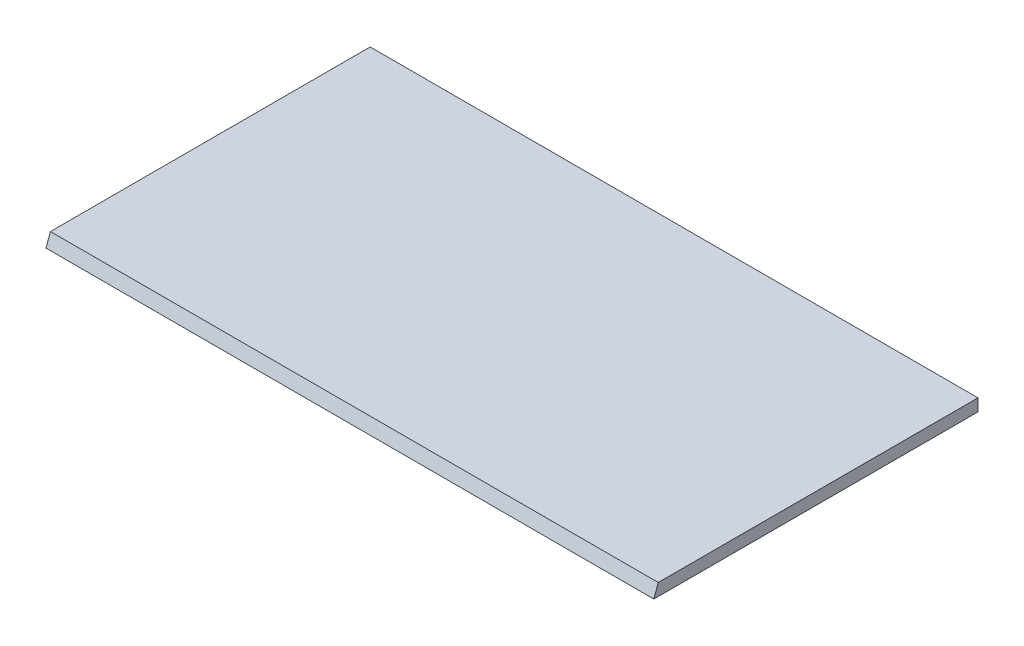
ISO-10303-21;
HEADER;
FILE_DESCRIPTION(('STEP AP214'),'2;1');
FILE_NAME('part.step','',(''),(''),'','','');
FILE_SCHEMA(('AUTOMOTIVE_DESIGN { 1 0 10303 214 1 1 1 1 }'));
ENDSEC;
DATA;
#1=APPLICATION_CONTEXT('core data for automotive mechanical design processes');
#2=APPLICATION_PROTOCOL_DEFINITION('international standard','automotive_design',2000,#1);
#3=PRODUCT_CONTEXT('',#1,'mechanical');
#4=PRODUCT('Part','Part','',(#3));
#5=PRODUCT_RELATED_PRODUCT_CATEGORY('part','',(#4));
#6=PRODUCT_DEFINITION_FORMATION('','',#4);
#7=PRODUCT_DEFINITION_CONTEXT('part definition',#1,'design');
#8=PRODUCT_DEFINITION('design','',#6,#7);
#9=PRODUCT_DEFINITION_SHAPE('','',#8);
#10=(LENGTH_UNIT() NAMED_UNIT(*) SI_UNIT(.MILLI.,.METRE.));
#11=(NAMED_UNIT(*) PLANE_ANGLE_UNIT() SI_UNIT($,.RADIAN.));
#12=(NAMED_UNIT(*) SI_UNIT($,.STERADIAN.) SOLID_ANGLE_UNIT());
#13=UNCERTAINTY_MEASURE_WITH_UNIT(LENGTH_MEASURE(1.E-05),#10,'distance_accuracy_value','');
#14=(GEOMETRIC_REPRESENTATION_CONTEXT(3) GLOBAL_UNCERTAINTY_ASSIGNED_CONTEXT((#13)) GLOBAL_UNIT_ASSIGNED_CONTEXT((#10,
#11,#12)) REPRESENTATION_CONTEXT('',''));
#15=CARTESIAN_POINT('',(0.,0.,0.));
#16=DIRECTION('',(0.,0.,1.));
#17=DIRECTION('',(1.,0.,0.));
#18=AXIS2_PLACEMENT_3D('',#15,#16,#17);
#19=CARTESIAN_POINT('',(0.,3.,0.));
#20=DIRECTION('',(1.,0.,0.));
#21=DIRECTION('',(0.,0.,-1.));
#22=AXIS2_PLACEMENT_3D('',#19,#20,#21);
#23=PLANE('',#22);
#24=DIRECTION('',(0.,0.,1.));
#25=VECTOR('',#24,1.);
#26=CARTESIAN_POINT('',(0.,0.,0.));
#27=LINE('',#26,#25);
#28=CARTESIAN_POINT('',(0.,0.,-80.));
#29=VERTEX_POINT('',#28);
#30=CARTESIAN_POINT('',(0.,0.,0.));
#31=VERTEX_POINT('',#30);
#32=EDGE_CURVE('E100',#29,#31,#27,.T.);
#33=ORIENTED_EDGE('',*,*,#32,.T.);
#34=DIRECTION('',(0.,-0.939692620785909,0.342020143325666));
#35=VECTOR('',#34,1.);
#36=CARTESIAN_POINT('',(0.,3.,-1.09191070279862));
#37=LINE('',#36,#35);
#38=CARTESIAN_POINT('',(0.,3.,-1.09191070279862));
#39=VERTEX_POINT('',#38);
#40=EDGE_CURVE('E11',#31,#39,#37,.F.);
#41=ORIENTED_EDGE('',*,*,#40,.T.);
#42=DIRECTION('',(0.,0.,1.));
#43=VECTOR('',#42,1.);
#44=CARTESIAN_POINT('',(0.,3.,0.));
#45=LINE('',#44,#43);
#46=CARTESIAN_POINT('',(0.,3.,-80.));
#47=VERTEX_POINT('',#46);
#48=EDGE_CURVE('E83',#47,#39,#45,.T.);
#49=ORIENTED_EDGE('',*,*,#48,.F.);
#50=DIRECTION('',(0.,-1.,0.));
#51=VECTOR('',#50,1.);
#52=CARTESIAN_POINT('',(0.,3.,-80.));
#53=LINE('',#52,#51);
#54=EDGE_CURVE('E92',#47,#29,#53,.T.);
#55=ORIENTED_EDGE('',*,*,#54,.T.);
#56=EDGE_LOOP('',(#33,#41,#49,#55));
#57=FACE_BOUND('',#56,.T.);
#58=ADVANCED_FACE('F35',(#57),#23,.F.);
#59=CARTESIAN_POINT('',(150.,3.,0.));
#60=DIRECTION('',(-1.,0.,0.));
#61=DIRECTION('',(0.,0.,1.));
#62=AXIS2_PLACEMENT_3D('',#59,#60,#61);
#63=PLANE('',#62);
#64=DIRECTION('',(0.,0.,-1.));
#65=VECTOR('',#64,1.);
#66=CARTESIAN_POINT('',(150.,3.,0.));
#67=LINE('',#66,#65);
#68=CARTESIAN_POINT('',(150.,3.,-1.09191070279862));
#69=VERTEX_POINT('',#68);
#70=CARTESIAN_POINT('',(150.,3.,-80.));
#71=VERTEX_POINT('',#70);
#72=EDGE_CURVE('E75',#69,#71,#67,.T.);
#73=ORIENTED_EDGE('',*,*,#72,.F.);
#74=DIRECTION('',(0.,0.939692620785909,-0.342020143325666));
#75=VECTOR('',#74,1.);
#76=CARTESIAN_POINT('',(150.,3.,-1.09191070279862));
#77=LINE('',#76,#75);
#78=CARTESIAN_POINT('',(150.,0.,0.));
#79=VERTEX_POINT('',#78);
#80=EDGE_CURVE('E43',#69,#79,#77,.F.);
#81=ORIENTED_EDGE('',*,*,#80,.T.);
#82=DIRECTION('',(0.,0.,-1.));
#83=VECTOR('',#82,1.);
#84=CARTESIAN_POINT('',(150.,0.,0.));
#85=LINE('',#84,#83);
#86=CARTESIAN_POINT('',(150.,0.,-80.));
#87=VERTEX_POINT('',#86);
#88=EDGE_CURVE('E89',#79,#87,#85,.T.);
#89=ORIENTED_EDGE('',*,*,#88,.T.);
#90=DIRECTION('',(0.,-1.,0.));
#91=VECTOR('',#90,1.);
#92=CARTESIAN_POINT('',(150.,3.,-80.));
#93=LINE('',#92,#91);
#94=EDGE_CURVE('E86',#71,#87,#93,.T.);
#95=ORIENTED_EDGE('',*,*,#94,.F.);
#96=EDGE_LOOP('',(#73,#81,#89,#95));
#97=FACE_BOUND('',#96,.T.);
#98=ADVANCED_FACE('F87',(#97),#63,.F.);
#99=CARTESIAN_POINT('',(0.,3.,-80.));
#100=DIRECTION('',(0.,0.,1.));
#101=DIRECTION('',(1.,0.,0.));
#102=AXIS2_PLACEMENT_3D('',#99,#100,#101);
#103=PLANE('',#102);
#104=DIRECTION('',(-1.,0.,0.));
#105=VECTOR('',#104,1.);
#106=CARTESIAN_POINT('',(0.,0.,-80.));
#107=LINE('',#106,#105);
#108=EDGE_CURVE('E105',#87,#29,#107,.T.);
#109=ORIENTED_EDGE('',*,*,#108,.T.);
#110=ORIENTED_EDGE('',*,*,#54,.F.);
#111=DIRECTION('',(-1.,0.,0.));
#112=VECTOR('',#111,1.);
#113=CARTESIAN_POINT('',(0.,3.,-80.));
#114=LINE('',#113,#112);
#115=EDGE_CURVE('E79',#71,#47,#114,.T.);
#116=ORIENTED_EDGE('',*,*,#115,.F.);
#117=ORIENTED_EDGE('',*,*,#94,.T.);
#118=EDGE_LOOP('',(#109,#110,#116,#117));
#119=FACE_BOUND('',#118,.T.);
#120=ADVANCED_FACE('F94',(#119),#103,.F.);
#121=CARTESIAN_POINT('',(0.,3.,0.));
#122=DIRECTION('',(0.,-1.,0.));
#123=DIRECTION('',(0.,0.,-1.));
#124=AXIS2_PLACEMENT_3D('',#121,#122,#123);
#125=PLANE('',#124);
#126=ORIENTED_EDGE('',*,*,#48,.T.);
#127=DIRECTION('',(1.,0.,0.));
#128=VECTOR('',#127,1.);
#129=CARTESIAN_POINT('',(0.,3.,-1.09191070279862));
#130=LINE('',#129,#128);
#131=EDGE_CURVE('E81',#39,#69,#130,.T.);
#132=ORIENTED_EDGE('',*,*,#131,.T.);
#133=ORIENTED_EDGE('',*,*,#72,.T.);
#134=ORIENTED_EDGE('',*,*,#115,.T.);
#135=EDGE_LOOP('',(#126,#132,#133,#134));
#136=FACE_BOUND('',#135,.T.);
#137=ADVANCED_FACE('F77',(#136),#125,.F.);
#138=CARTESIAN_POINT('',(0.,0.,0.));
#139=DIRECTION('',(0.,-1.,0.));
#140=DIRECTION('',(0.,0.,-1.));
#141=AXIS2_PLACEMENT_3D('',#138,#139,#140);
#142=PLANE('',#141);
#143=ORIENTED_EDGE('',*,*,#32,.F.);
#144=ORIENTED_EDGE('',*,*,#108,.F.);
#145=ORIENTED_EDGE('',*,*,#88,.F.);
#146=DIRECTION('',(1.,0.,0.));
#147=VECTOR('',#146,1.);
#148=CARTESIAN_POINT('',(0.,0.,0.));
#149=LINE('',#148,#147);
#150=EDGE_CURVE('E102',#31,#79,#149,.T.);
#151=ORIENTED_EDGE('',*,*,#150,.F.);
#152=EDGE_LOOP('',(#143,#144,#145,#151));
#153=FACE_BOUND('',#152,.T.);
#154=ADVANCED_FACE('F109',(#153),#142,.T.);
#155=CARTESIAN_POINT('',(0.,3.,-1.09191070279862));
#156=DIRECTION('',(0.,-0.342020143325666,-0.939692620785909));
#157=DIRECTION('',(1.,0.,0.));
#158=AXIS2_PLACEMENT_3D('',#155,#156,#157);
#159=PLANE('',#158);
#160=ORIENTED_EDGE('',*,*,#40,.F.);
#161=ORIENTED_EDGE('',*,*,#150,.T.);
#162=ORIENTED_EDGE('',*,*,#80,.F.);
#163=ORIENTED_EDGE('',*,*,#131,.F.);
#164=EDGE_LOOP('',(#160,#161,#162,#163));
#165=FACE_BOUND('',#164,.T.);
#166=ADVANCED_FACE('F37',(#165),#159,.F.);
#167=CLOSED_SHELL('',(#58,#98,#120,#137,#154,#166));
#168=MANIFOLD_SOLID_BREP('B2',#167);
#169=ADVANCED_BREP_SHAPE_REPRESENTATION('',(#18,#168),#14);
#170=SHAPE_DEFINITION_REPRESENTATION(#9,#169);
ENDSEC;
END-ISO-10303-21;
